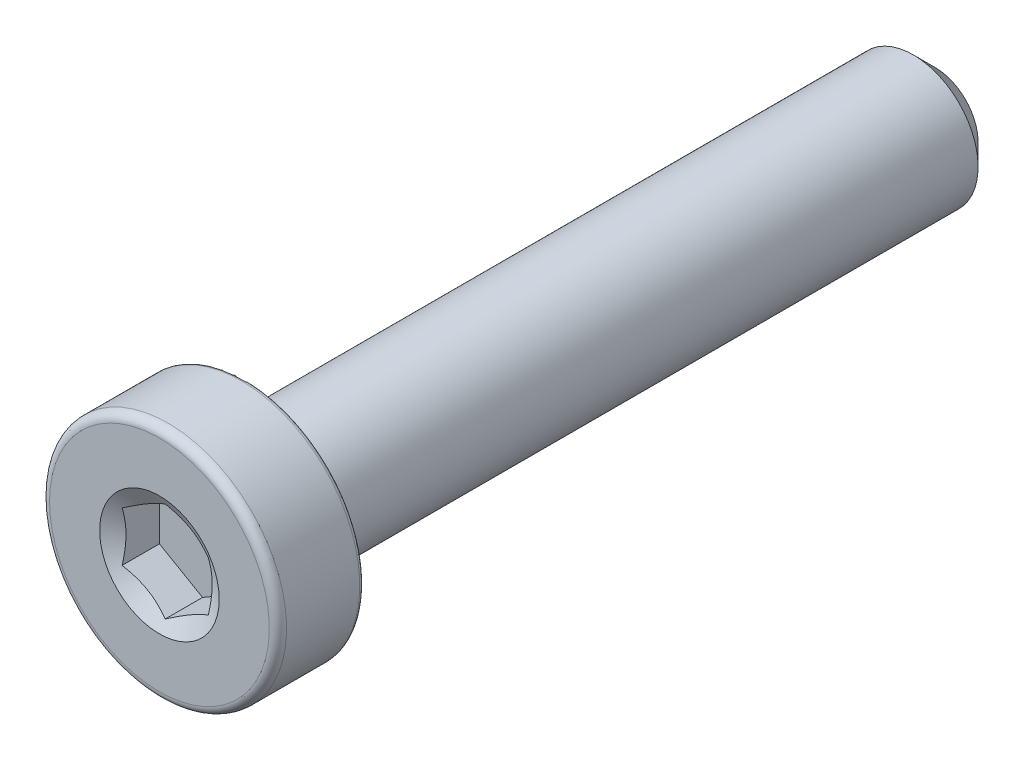
ISO-10303-21;
HEADER;
FILE_DESCRIPTION(('STEP AP214'),'2;1');
FILE_NAME('part.step','',(''),(''),'','','');
FILE_SCHEMA(('AUTOMOTIVE_DESIGN { 1 0 10303 214 1 1 1 1 }'));
ENDSEC;
DATA;
#1=APPLICATION_CONTEXT('core data for automotive mechanical design processes');
#2=APPLICATION_PROTOCOL_DEFINITION('international standard','automotive_design',2000,#1);
#3=PRODUCT_CONTEXT('',#1,'mechanical');
#4=PRODUCT('Part','Part','',(#3));
#5=PRODUCT_RELATED_PRODUCT_CATEGORY('part','',(#4));
#6=PRODUCT_DEFINITION_FORMATION('','',#4);
#7=PRODUCT_DEFINITION_CONTEXT('part definition',#1,'design');
#8=PRODUCT_DEFINITION('design','',#6,#7);
#9=PRODUCT_DEFINITION_SHAPE('','',#8);
#10=(LENGTH_UNIT() NAMED_UNIT(*) SI_UNIT(.MILLI.,.METRE.));
#11=(NAMED_UNIT(*) PLANE_ANGLE_UNIT() SI_UNIT($,.RADIAN.));
#12=(NAMED_UNIT(*) SI_UNIT($,.STERADIAN.) SOLID_ANGLE_UNIT());
#13=UNCERTAINTY_MEASURE_WITH_UNIT(LENGTH_MEASURE(1.E-05),#10,'distance_accuracy_value','');
#14=(GEOMETRIC_REPRESENTATION_CONTEXT(3) GLOBAL_UNCERTAINTY_ASSIGNED_CONTEXT((#13)) GLOBAL_UNIT_ASSIGNED_CONTEXT((#10,
#11,#12)) REPRESENTATION_CONTEXT('',''));
#15=CARTESIAN_POINT('',(0.,0.,0.));
#16=DIRECTION('',(0.,0.,1.));
#17=DIRECTION('',(1.,0.,0.));
#18=AXIS2_PLACEMENT_3D('',#15,#16,#17);
#19=CARTESIAN_POINT('',(0.,0.,-9.));
#20=DIRECTION('',(0.,0.,-1.));
#21=DIRECTION('',(-1.,0.,0.));
#22=AXIS2_PLACEMENT_3D('',#19,#20,#21);
#23=PLANE('',#22);
#24=CARTESIAN_POINT('',(0.,0.,-9.));
#25=DIRECTION('',(0.,0.,-1.));
#26=DIRECTION('',(-1.,0.,0.));
#27=AXIS2_PLACEMENT_3D('',#24,#25,#26);
#28=CIRCLE('',#27,1.);
#29=CARTESIAN_POINT('',(-1.,0.,-9.));
#30=VERTEX_POINT('',#29);
#31=EDGE_CURVE('E48',#30,#30,#28,.T.);
#32=ORIENTED_EDGE('',*,*,#31,.T.);
#33=EDGE_LOOP('',(#32));
#34=FACE_BOUND('',#33,.T.);
#35=ADVANCED_FACE('F35',(#34),#23,.T.);
#36=CARTESIAN_POINT('',(0.,0.,-9.));
#37=DIRECTION('',(0.,0.,1.));
#38=DIRECTION('',(1.,0.,0.));
#39=AXIS2_PLACEMENT_3D('',#36,#37,#38);
#40=CONICAL_SURFACE('',#39,1.,0.785398163397448);
#41=CARTESIAN_POINT('',(0.,0.,-8.5));
#42=DIRECTION('',(0.,0.,-1.));
#43=DIRECTION('',(-1.,0.,0.));
#44=AXIS2_PLACEMENT_3D('',#41,#42,#43);
#45=CIRCLE('',#44,1.5);
#46=CARTESIAN_POINT('',(-1.5,0.,-8.5));
#47=VERTEX_POINT('',#46);
#48=EDGE_CURVE('E133',#47,#47,#45,.T.);
#49=ORIENTED_EDGE('',*,*,#48,.T.);
#50=EDGE_LOOP('',(#49));
#51=FACE_BOUND('',#50,.T.);
#52=ORIENTED_EDGE('',*,*,#31,.F.);
#53=EDGE_LOOP('',(#52));
#54=FACE_BOUND('',#53,.T.);
#55=ADVANCED_FACE('F139',(#51,#54),#40,.T.);
#56=CARTESIAN_POINT('',(0.,0.,-9.));
#57=DIRECTION('',(0.,0.,-1.));
#58=DIRECTION('',(-1.,0.,0.));
#59=AXIS2_PLACEMENT_3D('',#56,#57,#58);
#60=CYLINDRICAL_SURFACE('',#59,1.5);
#61=CARTESIAN_POINT('',(0.,0.,7.));
#62=DIRECTION('',(0.,0.,-1.));
#63=DIRECTION('',(-1.,0.,0.));
#64=AXIS2_PLACEMENT_3D('',#61,#62,#63);
#65=CIRCLE('',#64,1.5);
#66=CARTESIAN_POINT('',(-1.5,0.,7.));
#67=VERTEX_POINT('',#66);
#68=EDGE_CURVE('E130',#67,#67,#65,.T.);
#69=ORIENTED_EDGE('',*,*,#68,.T.);
#70=EDGE_LOOP('',(#69));
#71=FACE_BOUND('',#70,.T.);
#72=ORIENTED_EDGE('',*,*,#48,.F.);
#73=EDGE_LOOP('',(#72));
#74=FACE_BOUND('',#73,.T.);
#75=ADVANCED_FACE('F141',(#71,#74),#60,.T.);
#76=CARTESIAN_POINT('',(0.,1.5,7.));
#77=DIRECTION('',(0.,0.,-1.));
#78=DIRECTION('',(-1.,0.,0.));
#79=AXIS2_PLACEMENT_3D('',#76,#77,#78);
#80=PLANE('',#79);
#81=CARTESIAN_POINT('',(0.,0.,7.));
#82=DIRECTION('',(0.,0.,-1.));
#83=DIRECTION('',(-1.,0.,0.));
#84=AXIS2_PLACEMENT_3D('',#81,#82,#83);
#85=CIRCLE('',#84,2.65);
#86=CARTESIAN_POINT('',(-2.65,0.,7.));
#87=VERTEX_POINT('',#86);
#88=EDGE_CURVE('E127',#87,#87,#85,.T.);
#89=ORIENTED_EDGE('',*,*,#88,.T.);
#90=EDGE_LOOP('',(#89));
#91=FACE_BOUND('',#90,.T.);
#92=ORIENTED_EDGE('',*,*,#68,.F.);
#93=EDGE_LOOP('',(#92));
#94=FACE_BOUND('',#93,.T.);
#95=ADVANCED_FACE('F147',(#91,#94),#80,.T.);
#96=CARTESIAN_POINT('',(0.,0.,7.1));
#97=DIRECTION('',(0.,0.,-1.));
#98=DIRECTION('',(-1.,0.,0.));
#99=AXIS2_PLACEMENT_3D('',#96,#97,#98);
#100=TOROIDAL_SURFACE('',#99,2.65,0.1);
#101=CARTESIAN_POINT('',(0.,0.,7.1));
#102=DIRECTION('',(0.,0.,-1.));
#103=DIRECTION('',(-1.,0.,0.));
#104=AXIS2_PLACEMENT_3D('',#101,#102,#103);
#105=CIRCLE('',#104,2.75);
#106=CARTESIAN_POINT('',(-2.75,0.,7.1));
#107=VERTEX_POINT('',#106);
#108=EDGE_CURVE('E124',#107,#107,#105,.T.);
#109=ORIENTED_EDGE('',*,*,#108,.T.);
#110=EDGE_LOOP('',(#109));
#111=FACE_BOUND('',#110,.T.);
#112=ORIENTED_EDGE('',*,*,#88,.F.);
#113=EDGE_LOOP('',(#112));
#114=FACE_BOUND('',#113,.T.);
#115=ADVANCED_FACE('F153',(#111,#114),#100,.T.);
#116=CARTESIAN_POINT('',(0.,0.,-9.));
#117=DIRECTION('',(0.,0.,-1.));
#118=DIRECTION('',(-1.,0.,0.));
#119=AXIS2_PLACEMENT_3D('',#116,#117,#118);
#120=CYLINDRICAL_SURFACE('',#119,2.75);
#121=CARTESIAN_POINT('',(0.,0.,8.8));
#122=DIRECTION('',(0.,0.,-1.));
#123=DIRECTION('',(-1.,0.,0.));
#124=AXIS2_PLACEMENT_3D('',#121,#122,#123);
#125=CIRCLE('',#124,2.75);
#126=CARTESIAN_POINT('',(-2.75,0.,8.8));
#127=VERTEX_POINT('',#126);
#128=EDGE_CURVE('E121',#127,#127,#125,.T.);
#129=ORIENTED_EDGE('',*,*,#128,.T.);
#130=EDGE_LOOP('',(#129));
#131=FACE_BOUND('',#130,.T.);
#132=ORIENTED_EDGE('',*,*,#108,.F.);
#133=EDGE_LOOP('',(#132));
#134=FACE_BOUND('',#133,.T.);
#135=ADVANCED_FACE('F157',(#131,#134),#120,.T.);
#136=CARTESIAN_POINT('',(0.,0.,8.8));
#137=DIRECTION('',(0.,0.,-1.));
#138=DIRECTION('',(-1.,0.,0.));
#139=AXIS2_PLACEMENT_3D('',#136,#137,#138);
#140=TOROIDAL_SURFACE('',#139,2.55,0.2);
#141=CARTESIAN_POINT('',(0.,0.,9.));
#142=DIRECTION('',(0.,0.,-1.));
#143=DIRECTION('',(-1.,0.,0.));
#144=AXIS2_PLACEMENT_3D('',#141,#142,#143);
#145=CIRCLE('',#144,2.55);
#146=CARTESIAN_POINT('',(-2.55,0.,9.));
#147=VERTEX_POINT('',#146);
#148=EDGE_CURVE('E118',#147,#147,#145,.T.);
#149=ORIENTED_EDGE('',*,*,#148,.T.);
#150=EDGE_LOOP('',(#149));
#151=FACE_BOUND('',#150,.T.);
#152=ORIENTED_EDGE('',*,*,#128,.F.);
#153=EDGE_LOOP('',(#152));
#154=FACE_BOUND('',#153,.T.);
#155=ADVANCED_FACE('F161',(#151,#154),#140,.T.);
#156=CARTESIAN_POINT('',(0.,2.55,9.));
#157=DIRECTION('',(0.,0.,1.));
#158=DIRECTION('',(1.,0.,0.));
#159=AXIS2_PLACEMENT_3D('',#156,#157,#158);
#160=PLANE('',#159);
#161=CARTESIAN_POINT('',(0.,0.,9.));
#162=DIRECTION('',(0.,0.,1.));
#163=DIRECTION('',(1.,0.,0.));
#164=AXIS2_PLACEMENT_3D('',#161,#162,#163);
#165=CIRCLE('',#164,1.38725044864937);
#166=CARTESIAN_POINT('',(1.38725044864937,0.,9.));
#167=VERTEX_POINT('',#166);
#168=EDGE_CURVE('E255',#167,#167,#165,.T.);
#169=ORIENTED_EDGE('',*,*,#168,.F.);
#170=EDGE_LOOP('',(#169));
#171=FACE_BOUND('',#170,.T.);
#172=ORIENTED_EDGE('',*,*,#148,.F.);
#173=EDGE_LOOP('',(#172));
#174=FACE_BOUND('',#173,.T.);
#175=ADVANCED_FACE('F165',(#171,#174),#160,.T.);
#176=CARTESIAN_POINT('',(0.,0.,9.));
#177=DIRECTION('',(0.,0.,1.));
#178=DIRECTION('',(1.,0.,0.));
#179=AXIS2_PLACEMENT_3D('',#176,#177,#178);
#180=CONICAL_SURFACE('',#179,1.38725044864937,1.0471975511966);
#181=ORIENTED_EDGE('',*,*,#168,.T.);
#182=EDGE_LOOP('',(#181));
#183=FACE_BOUND('',#182,.T.);
#184=CARTESIAN_POINT('',(1.0002,0.577234799135784,8.86580392337119));
#185=CARTESIAN_POINT('',(0.956252680601717,0.602607795820544,8.85114622035467));
#186=CARTESIAN_POINT('',(0.911926016050177,0.628199807531654,8.83781497032642));
#187=CARTESIAN_POINT('',(0.822504925328876,0.679827098330827,8.81454375432898));
#188=CARTESIAN_POINT('',(0.777408908798267,0.705863295614154,8.8046120232553));
#189=CARTESIAN_POINT('',(0.68777582947738,0.757612978088363,8.7891499415876));
#190=CARTESIAN_POINT('',(0.643252567766779,0.783318495222178,8.78351671480448));
#191=CARTESIAN_POINT('',(0.553996260284981,0.834850648373666,8.77678853534577));
#192=CARTESIAN_POINT('',(0.509263539518504,0.860677096749776,8.77568801462719));
#193=CARTESIAN_POINT('',(0.425658889182652,0.908946264126685,8.77796229900366));
#194=CARTESIAN_POINT('',(0.386774523211232,0.931396163287552,8.78077868556893));
#195=CARTESIAN_POINT('',(0.309259155014812,0.976149681982088,8.78970969692287));
#196=CARTESIAN_POINT('',(0.270628421438359,0.998453146411446,8.79582738045982));
#197=CARTESIAN_POINT('',(0.192952883515852,1.04329913914045,8.81112297243135));
#198=CARTESIAN_POINT('',(0.15391792372883,1.0658359836813,8.82036579887448));
#199=CARTESIAN_POINT('',(0.076430618723985,1.11057330008462,8.84134409246105));
#200=CARTESIAN_POINT('',(0.0379772787061378,1.13277434629517,8.85307462183919));
#201=CARTESIAN_POINT('',(-0.000200000000002924,1.15481600843309,8.86580392337119));
#202=B_SPLINE_CURVE_WITH_KNOTS('',3,(#184,#185,#186,#187,#188,#189,#190,#191,#192,#193,#194,
#195,#196,#197,#198,#199,#200,#201),.UNSPECIFIED.,.F.,.F.,(4,2,2,2,2,2,2,2,4),(0.,
0.158523820030115,0.317428970089341,0.472400167924632,0.627180939971646,0.762016584872709,
0.896977373984232,1.03493410168667,1.17261952416172),.UNSPECIFIED.);
#203=CARTESIAN_POINT('',(0.999999999999997,0.577350269189622,8.86573724670552));
#204=VERTEX_POINT('',#203);
#205=CARTESIAN_POINT('',(0.,1.15470053837925,8.86573724670552));
#206=VERTEX_POINT('',#205);
#207=EDGE_CURVE('E102',#204,#206,#202,.T.);
#208=ORIENTED_EDGE('',*,*,#207,.F.);
#209=CARTESIAN_POINT('',(0.999999999999996,-1.52531406916342,9.25209527262491));
#210=CARTESIAN_POINT('',(0.999999999999996,-1.48182861268046,9.23110266541125));
#211=CARTESIAN_POINT('',(0.999999999999996,-1.43824104401544,9.2103225414218));
#212=CARTESIAN_POINT('',(0.999999999999996,-1.35080588283853,9.16929809609279));
#213=CARTESIAN_POINT('',(0.999999999999996,-1.30695824811621,9.14905386481636));
#214=CARTESIAN_POINT('',(0.999999999999996,-1.17446402318513,9.08907572495865));
#215=CARTESIAN_POINT('',(0.999999999999996,-1.08535857783385,9.05033728704522));
#216=CARTESIAN_POINT('',(0.999999999999996,-0.902813286780576,8.97597487261951));
#217=CARTESIAN_POINT('',(0.999999999999997,-0.809322697025034,8.94047389642041));
#218=CARTESIAN_POINT('',(0.999999999999997,-0.619948426356521,8.87691775005073));
#219=CARTESIAN_POINT('',(0.999999999999996,-0.524071266658433,8.84884430376285));
#220=CARTESIAN_POINT('',(0.999999999999997,-0.378406603927923,8.81584291166321));
#221=CARTESIAN_POINT('',(0.999999999999997,-0.329661184931859,8.80637232219308));
#222=CARTESIAN_POINT('',(0.999999999999997,-0.231590729483153,8.79107470800451));
#223=CARTESIAN_POINT('',(0.999999999999997,-0.182265743798226,8.78524736654073));
#224=CARTESIAN_POINT('',(0.999999999999997,-0.0839161152817316,8.7777760886091));
#225=CARTESIAN_POINT('',(0.999999999999997,-0.0348955138861114,8.77608038814163));
#226=CARTESIAN_POINT('',(0.999999999999997,0.0631106437129204,8.77687621074871));
#227=CARTESIAN_POINT('',(0.999999999999997,0.112096198103291,8.77936793670139));
#228=CARTESIAN_POINT('',(0.999999999999997,0.231132047870783,8.7902915878432));
#229=CARTESIAN_POINT('',(0.999999999999997,0.300987455206452,8.80085135420135));
#230=CARTESIAN_POINT('',(0.999999999999997,0.439393345717322,8.82857147462579));
#231=CARTESIAN_POINT('',(0.999999999999997,0.507942223075051,8.84573946268281));
#232=CARTESIAN_POINT('',(0.999999999999997,0.610490153022872,8.87528485985339));
#233=CARTESIAN_POINT('',(0.999999999999997,0.645014670741595,8.88590779291819));
#234=CARTESIAN_POINT('',(0.999999999999997,0.713703860484178,8.90819373506489));
#235=CARTESIAN_POINT('',(0.999999999999997,0.747868738383105,8.91985610834604));
#236=CARTESIAN_POINT('',(0.999999999999997,0.849894218405036,8.95613455789374));
#237=CARTESIAN_POINT('',(0.999999999999997,0.917293751200417,8.98204438461689));
#238=CARTESIAN_POINT('',(0.999999999999997,1.03934046620428,9.03147531764067));
#239=CARTESIAN_POINT('',(0.999999999999997,1.09414518158637,9.05461480046635));
#240=CARTESIAN_POINT('',(0.999999999999997,1.20322444414755,9.10211549084186));
#241=CARTESIAN_POINT('',(0.999999999999997,1.25749896725618,9.12647675355475));
#242=CARTESIAN_POINT('',(0.999999999999997,1.41971593401094,9.20094472569166));
#243=CARTESIAN_POINT('',(0.999999999999997,1.52702559075604,9.25242465614905));
#244=CARTESIAN_POINT('',(0.999999999999997,1.74069917257064,9.35765571572189));
#245=CARTESIAN_POINT('',(0.999999999999997,1.84706155682499,9.4114099346413));
#246=CARTESIAN_POINT('',(0.999999999999997,2.05903153278512,9.52034282574241));
#247=CARTESIAN_POINT('',(0.999999999999998,2.16463924030401,9.57552127309501));
#248=CARTESIAN_POINT('',(0.999999999999998,2.36471708801433,9.68123542491892));
#249=CARTESIAN_POINT('',(0.999999999999998,2.45923648811061,9.7316782365578));
#250=CARTESIAN_POINT('',(0.999999999999998,2.64797010813398,9.83314147876285));
#251=CARTESIAN_POINT('',(0.999999999999998,2.74218431378497,9.88416193586177));
#252=CARTESIAN_POINT('',(0.999999999999998,2.93010687272875,9.98648491478121));
#253=CARTESIAN_POINT('',(0.999999999999998,3.02381590124115,10.0377861982146));
#254=CARTESIAN_POINT('',(0.999999999999998,3.21104433026394,10.140720116336));
#255=CARTESIAN_POINT('',(0.999999999999998,3.3045637421293,10.1923527303624));
#256=CARTESIAN_POINT('',(0.999999999999998,3.39801583309777,10.244106162613));
#257=B_SPLINE_CURVE_WITH_KNOTS('',3,(#209,#210,#211,#212,#213,#214,#215,#216,#217,#218,#219,
#220,#221,#222,#223,#224,#225,#226,#227,#228,#229,#230,#231,#232,#233,#234,#235,#236,#237,#238,
#239,#240,#241,#242,#243,#244,#245,#246,#247,#248,#249,#250,#251,#252,#253,#254,#255,#256),
.UNSPECIFIED.,.F.,.F.,(4,2,2,2,2,2,2,2,2,2,2,2,2,2,2,2,2,2,2,2,2,2,2,4),(0.,0.144860035350267,
0.28974426354594,0.581156970731407,0.88102618477544,1.18015053255112,1.32900921447324,
1.47785495276638,1.62482603693997,1.77180424197377,1.98331769369783,2.19507622821808,
2.30342893158603,2.41171580717751,2.62826427599132,2.80671773664952,2.98517926170136,
3.34218741743347,3.69969723551897,4.05715095805976,4.37856050020064,4.69998486589634,
5.02048193585065,5.34095921015368),.UNSPECIFIED.);
#258=CARTESIAN_POINT('',(0.999999999999997,-0.577350269189624,8.86573724670552));
#259=VERTEX_POINT('',#258);
#260=EDGE_CURVE('E211',#259,#204,#257,.T.);
#261=ORIENTED_EDGE('',*,*,#260,.F.);
#262=CARTESIAN_POINT('',(-0.000200000000000269,-1.15481600843309,8.86580392337119));
#263=CARTESIAN_POINT('',(0.0437473193982793,-1.12944301174833,8.85114622035467));
#264=CARTESIAN_POINT('',(0.0880739839498194,-1.10385100003722,8.83781497032642));
#265=CARTESIAN_POINT('',(0.177495074671121,-1.05222370923804,8.81454375432898));
#266=CARTESIAN_POINT('',(0.22259109120173,-1.02618751195472,8.80461202325531));
#267=CARTESIAN_POINT('',(0.312224170522618,-0.974437829480508,8.7891499415876));
#268=CARTESIAN_POINT('',(0.356747432233218,-0.948732312346692,8.78351671480448));
#269=CARTESIAN_POINT('',(0.446003739715016,-0.897200159195205,8.77678853534578));
#270=CARTESIAN_POINT('',(0.490736460481493,-0.871373710819095,8.77568801462719));
#271=CARTESIAN_POINT('',(0.574341110817345,-0.823104543442186,8.77796229900366));
#272=CARTESIAN_POINT('',(0.613225476788764,-0.800654644281319,8.78077868556893));
#273=CARTESIAN_POINT('',(0.690740844985184,-0.755901125586783,8.78970969692287));
#274=CARTESIAN_POINT('',(0.729371578561637,-0.733597661157425,8.79582738045982));
#275=CARTESIAN_POINT('',(0.807047116484142,-0.688751668428418,8.81112297243135));
#276=CARTESIAN_POINT('',(0.846082076271165,-0.666214823887574,8.82036579887448));
#277=CARTESIAN_POINT('',(0.923569381276009,-0.621477507484248,8.84134409246105));
#278=CARTESIAN_POINT('',(0.962022721293856,-0.599276461273704,8.85307462183919));
#279=CARTESIAN_POINT('',(1.0002,-0.577234799135787,8.86580392337119));
#280=B_SPLINE_CURVE_WITH_KNOTS('',3,(#262,#263,#264,#265,#266,#267,#268,#269,#270,#271,#272,
#273,#274,#275,#276,#277,#278,#279),.UNSPECIFIED.,.F.,.F.,(4,2,2,2,2,2,2,2,4),(0.,
0.158523820030115,0.317428970089341,0.472400167924632,0.627180939971646,0.762016584872709,
0.89697737398423,1.03493410168667,1.17261952416172),.UNSPECIFIED.);
#281=CARTESIAN_POINT('',(0.,-1.15470053837925,8.86573724670552));
#282=VERTEX_POINT('',#281);
#283=EDGE_CURVE('E205',#282,#259,#280,.T.);
#284=ORIENTED_EDGE('',*,*,#283,.F.);
#285=CARTESIAN_POINT('',(-1.0002,-0.577234799135788,8.86580392337119));
#286=CARTESIAN_POINT('',(-0.956252680601717,-0.602607795820547,8.85114622035467));
#287=CARTESIAN_POINT('',(-0.911926016050177,-0.628199807531657,8.83781497032642));
#288=CARTESIAN_POINT('',(-0.822504925328876,-0.679827098330831,8.81454375432898));
#289=CARTESIAN_POINT('',(-0.777408908798266,-0.705863295614158,8.80461202325531));
#290=CARTESIAN_POINT('',(-0.687775829477379,-0.757612978088367,8.7891499415876));
#291=CARTESIAN_POINT('',(-0.643252567766779,-0.783318495222182,8.78351671480448));
#292=CARTESIAN_POINT('',(-0.553996260284981,-0.83485064837367,8.77678853534578));
#293=CARTESIAN_POINT('',(-0.509263539518504,-0.86067709674978,8.77568801462719));
#294=CARTESIAN_POINT('',(-0.425658889182652,-0.908946264126688,8.77796229900366));
#295=CARTESIAN_POINT('',(-0.386774523211233,-0.931396163287555,8.78077868556893));
#296=CARTESIAN_POINT('',(-0.309259155014813,-0.976149681982091,8.78970969692287));
#297=CARTESIAN_POINT('',(-0.27062842143836,-0.998453146411449,8.79582738045982));
#298=CARTESIAN_POINT('',(-0.192952883515855,-1.04329913914046,8.81112297243135));
#299=CARTESIAN_POINT('',(-0.153917923728832,-1.0658359836813,8.82036579887448));
#300=CARTESIAN_POINT('',(-0.0764306187239882,-1.11057330008463,8.84134409246105));
#301=CARTESIAN_POINT('',(-0.0379772787061411,-1.13277434629517,8.85307462183919));
#302=CARTESIAN_POINT('',(0.000199999999999541,-1.15481600843309,8.86580392337119));
#303=B_SPLINE_CURVE_WITH_KNOTS('',3,(#285,#286,#287,#288,#289,#290,#291,#292,#293,#294,#295,
#296,#297,#298,#299,#300,#301,#302),.UNSPECIFIED.,.F.,.F.,(4,2,2,2,2,2,2,2,4),(0.,
0.158523820030115,0.317428970089341,0.472400167924631,0.627180939971646,0.762016584872708,
0.896977373984229,1.03493410168667,1.17261952416171),.UNSPECIFIED.);
#304=CARTESIAN_POINT('',(-0.999999999999997,-0.577350269189626,8.86573724670552));
#305=VERTEX_POINT('',#304);
#306=EDGE_CURVE('E55',#305,#282,#303,.T.);
#307=ORIENTED_EDGE('',*,*,#306,.F.);
#308=CARTESIAN_POINT('',(-0.999999999999996,-1.52531406916343,9.25209527262491));
#309=CARTESIAN_POINT('',(-0.999999999999997,-1.48182861268046,9.23110266541126));
#310=CARTESIAN_POINT('',(-0.999999999999997,-1.43824104401544,9.21032254142181));
#311=CARTESIAN_POINT('',(-0.999999999999997,-1.35080588283854,9.16929809609279));
#312=CARTESIAN_POINT('',(-0.999999999999997,-1.30695824811622,9.14905386481637));
#313=CARTESIAN_POINT('',(-0.999999999999997,-1.17446402318513,9.08907572495865));
#314=CARTESIAN_POINT('',(-0.999999999999997,-1.08535857783386,9.05033728704522));
#315=CARTESIAN_POINT('',(-0.999999999999997,-0.902813286780579,8.97597487261951));
#316=CARTESIAN_POINT('',(-0.999999999999997,-0.809322697025038,8.94047389642042));
#317=CARTESIAN_POINT('',(-0.999999999999997,-0.619948426356524,8.87691775005074));
#318=CARTESIAN_POINT('',(-0.999999999999997,-0.524071266658436,8.84884430376285));
#319=CARTESIAN_POINT('',(-0.999999999999998,-0.378406603927925,8.81584291166321));
#320=CARTESIAN_POINT('',(-0.999999999999998,-0.329661184931861,8.80637232219308));
#321=CARTESIAN_POINT('',(-0.999999999999998,-0.231590729483154,8.79107470800451));
#322=CARTESIAN_POINT('',(-0.999999999999998,-0.182265743798227,8.78524736654074));
#323=CARTESIAN_POINT('',(-0.999999999999998,-0.0839161152817324,8.7777760886091));
#324=CARTESIAN_POINT('',(-0.999999999999998,-0.0348955138861119,8.77608038814163));
#325=CARTESIAN_POINT('',(-0.999999999999998,0.0631106437129202,8.77687621074871));
#326=CARTESIAN_POINT('',(-0.999999999999998,0.112096198103291,8.77936793670139));
#327=CARTESIAN_POINT('',(-0.999999999999998,0.231132047870784,8.7902915878432));
#328=CARTESIAN_POINT('',(-0.999999999999999,0.300987455206452,8.80085135420135));
#329=CARTESIAN_POINT('',(-0.999999999999999,0.439393345717323,8.82857147462579));
#330=CARTESIAN_POINT('',(-0.999999999999999,0.507942223075052,8.84573946268281));
#331=CARTESIAN_POINT('',(-0.999999999999999,0.610490153022873,8.87528485985339));
#332=CARTESIAN_POINT('',(-0.999999999999999,0.645014670741595,8.88590779291819));
#333=CARTESIAN_POINT('',(-0.999999999999999,0.713703860484179,8.90819373506489));
#334=CARTESIAN_POINT('',(-0.999999999999999,0.747868738383106,8.91985610834604));
#335=CARTESIAN_POINT('',(-0.999999999999999,0.849894218405037,8.95613455789374));
#336=CARTESIAN_POINT('',(-0.999999999999999,0.917293751200418,8.98204438461689));
#337=CARTESIAN_POINT('',(-0.999999999999999,1.03934046620429,9.03147531764068));
#338=CARTESIAN_POINT('',(-0.999999999999999,1.09414518158637,9.05461480046635));
#339=CARTESIAN_POINT('',(-0.999999999999999,1.20322444414755,9.10211549084187));
#340=CARTESIAN_POINT('',(-1.,1.25749896725618,9.12647675355475));
#341=CARTESIAN_POINT('',(-1.,1.41971593401095,9.20094472569166));
#342=CARTESIAN_POINT('',(-1.,1.52702559075604,9.25242465614905));
#343=CARTESIAN_POINT('',(-1.,1.74069917257065,9.3576557157219));
#344=CARTESIAN_POINT('',(-1.,1.847061556825,9.41140993464131));
#345=CARTESIAN_POINT('',(-1.,2.05903153278512,9.52034282574242));
#346=CARTESIAN_POINT('',(-1.,2.16463924030401,9.57552127309501));
#347=CARTESIAN_POINT('',(-1.,2.36471708801434,9.68123542491893));
#348=CARTESIAN_POINT('',(-1.,2.45923648811061,9.7316782365578));
#349=CARTESIAN_POINT('',(-1.,2.64797010813399,9.83314147876285));
#350=CARTESIAN_POINT('',(-1.,2.74218431378498,9.88416193586178));
#351=CARTESIAN_POINT('',(-1.,2.93010687272876,9.98648491478122));
#352=CARTESIAN_POINT('',(-1.,3.02381590124115,10.0377861982146));
#353=CARTESIAN_POINT('',(-1.,3.21104433026394,10.140720116336));
#354=CARTESIAN_POINT('',(-1.,3.3045637421293,10.1923527303624));
#355=CARTESIAN_POINT('',(-1.,3.39801583309777,10.244106162613));
#356=B_SPLINE_CURVE_WITH_KNOTS('',3,(#308,#309,#310,#311,#312,#313,#314,#315,#316,#317,#318,
#319,#320,#321,#322,#323,#324,#325,#326,#327,#328,#329,#330,#331,#332,#333,#334,#335,#336,#337,
#338,#339,#340,#341,#342,#343,#344,#345,#346,#347,#348,#349,#350,#351,#352,#353,#354,#355),
.UNSPECIFIED.,.F.,.F.,(4,2,2,2,2,2,2,2,2,2,2,2,2,2,2,2,2,2,2,2,2,2,2,4),(0.,0.144860035350268,
0.28974426354594,0.581156970731408,0.881026184775441,1.18015053255113,1.32900921447324,
1.47785495276638,1.62482603693997,1.77180424197378,1.98331769369784,2.19507622821809,
2.30342893158604,2.41171580717752,2.62826427599132,2.80671773664952,2.98517926170136,
3.34218741743348,3.69969723551898,4.05715095805977,4.37856050020066,4.69998486589635,
5.02048193585066,5.34095921015369),.UNSPECIFIED.);
#357=CARTESIAN_POINT('',(-0.999999999999999,0.577350269189624,8.86573724670552));
#358=VERTEX_POINT('',#357);
#359=EDGE_CURVE('E11',#358,#305,#356,.F.);
#360=ORIENTED_EDGE('',*,*,#359,.F.);
#361=CARTESIAN_POINT('',(0.00019999999999696,1.15481600843309,8.86580392337119));
#362=CARTESIAN_POINT('',(-0.0437473193982829,1.12944301174833,8.85114622035467));
#363=CARTESIAN_POINT('',(-0.0880739839498231,1.10385100003722,8.83781497032642));
#364=CARTESIAN_POINT('',(-0.177495074671124,1.05222370923804,8.81454375432898));
#365=CARTESIAN_POINT('',(-0.222591091201733,1.02618751195472,8.80461202325531));
#366=CARTESIAN_POINT('',(-0.31222417052262,0.974437829480507,8.7891499415876));
#367=CARTESIAN_POINT('',(-0.356747432233221,0.948732312346691,8.78351671480448));
#368=CARTESIAN_POINT('',(-0.446003739715019,0.897200159195204,8.77678853534578));
#369=CARTESIAN_POINT('',(-0.490736460481496,0.871373710819094,8.77568801462719));
#370=CARTESIAN_POINT('',(-0.574341110817348,0.823104543442185,8.77796229900366));
#371=CARTESIAN_POINT('',(-0.613225476788767,0.800654644281318,8.78077868556893));
#372=CARTESIAN_POINT('',(-0.690740844985187,0.755901125586782,8.78970969692287));
#373=CARTESIAN_POINT('',(-0.729371578561639,0.733597661157425,8.79582738045982));
#374=CARTESIAN_POINT('',(-0.807047116484145,0.688751668428417,8.81112297243135));
#375=CARTESIAN_POINT('',(-0.846082076271167,0.666214823887573,8.82036579887448));
#376=CARTESIAN_POINT('',(-0.923569381276011,0.621477507484248,8.84134409246105));
#377=CARTESIAN_POINT('',(-0.962022721293858,0.599276461273704,8.85307462183919));
#378=CARTESIAN_POINT('',(-1.0002,0.577234799135786,8.86580392337119));
#379=B_SPLINE_CURVE_WITH_KNOTS('',3,(#361,#362,#363,#364,#365,#366,#367,#368,#369,#370,#371,
#372,#373,#374,#375,#376,#377,#378),.UNSPECIFIED.,.F.,.F.,(4,2,2,2,2,2,2,2,4),(0.,
0.158523820030115,0.317428970089341,0.472400167924632,0.627180939971646,0.762016584872708,
0.896977373984229,1.03493410168667,1.17261952416171),.UNSPECIFIED.);
#380=EDGE_CURVE('E93',#206,#358,#379,.T.);
#381=ORIENTED_EDGE('',*,*,#380,.F.);
#382=EDGE_LOOP('',(#208,#261,#284,#307,#360,#381));
#383=FACE_BOUND('',#382,.T.);
#384=ADVANCED_FACE('F92',(#183,#383),#180,.F.);
#385=CARTESIAN_POINT('',(0.,0.,8.));
#386=DIRECTION('',(0.,0.,1.));
#387=DIRECTION('',(1.,0.,0.));
#388=AXIS2_PLACEMENT_3D('',#385,#386,#387);
#389=PLANE('',#388);
#390=DIRECTION('',(-0.866025403784439,-0.5,0.));
#391=VECTOR('',#390,1.);
#392=CARTESIAN_POINT('',(0.,1.15470053837925,8.));
#393=LINE('',#392,#391);
#394=CARTESIAN_POINT('',(0.,1.15470053837925,8.));
#395=VERTEX_POINT('',#394);
#396=CARTESIAN_POINT('',(-0.999999999999999,0.577350269189624,8.));
#397=VERTEX_POINT('',#396);
#398=EDGE_CURVE('E101',#395,#397,#393,.T.);
#399=ORIENTED_EDGE('',*,*,#398,.T.);
#400=DIRECTION('',(0.,-1.,0.));
#401=VECTOR('',#400,1.);
#402=CARTESIAN_POINT('',(-0.999999999999999,0.577350269189624,8.));
#403=LINE('',#402,#401);
#404=CARTESIAN_POINT('',(-0.999999999999997,-0.577350269189626,8.));
#405=VERTEX_POINT('',#404);
#406=EDGE_CURVE('E106',#397,#405,#403,.T.);
#407=ORIENTED_EDGE('',*,*,#406,.T.);
#408=DIRECTION('',(0.866025403784439,-0.499999999999999,0.));
#409=VECTOR('',#408,1.);
#410=CARTESIAN_POINT('',(-0.999999999999997,-0.577350269189626,8.));
#411=LINE('',#410,#409);
#412=CARTESIAN_POINT('',(0.,-1.15470053837925,8.));
#413=VERTEX_POINT('',#412);
#414=EDGE_CURVE('E237',#405,#413,#411,.T.);
#415=ORIENTED_EDGE('',*,*,#414,.T.);
#416=DIRECTION('',(0.866025403784438,0.5,0.));
#417=VECTOR('',#416,1.);
#418=CARTESIAN_POINT('',(0.,-1.15470053837925,8.));
#419=LINE('',#418,#417);
#420=CARTESIAN_POINT('',(0.999999999999997,-0.577350269189625,8.));
#421=VERTEX_POINT('',#420);
#422=EDGE_CURVE('E241',#413,#421,#419,.T.);
#423=ORIENTED_EDGE('',*,*,#422,.T.);
#424=DIRECTION('',(0.,1.,0.));
#425=VECTOR('',#424,1.);
#426=CARTESIAN_POINT('',(0.999999999999997,-0.577350269189625,8.));
#427=LINE('',#426,#425);
#428=CARTESIAN_POINT('',(0.999999999999997,0.577350269189622,8.));
#429=VERTEX_POINT('',#428);
#430=EDGE_CURVE('E114',#421,#429,#427,.T.);
#431=ORIENTED_EDGE('',*,*,#430,.T.);
#432=DIRECTION('',(-0.866025403784439,0.5,0.));
#433=VECTOR('',#432,1.);
#434=CARTESIAN_POINT('',(0.999999999999997,0.577350269189622,8.));
#435=LINE('',#434,#433);
#436=EDGE_CURVE('E109',#429,#395,#435,.T.);
#437=ORIENTED_EDGE('',*,*,#436,.T.);
#438=EDGE_LOOP('',(#399,#407,#415,#423,#431,#437));
#439=FACE_BOUND('',#438,.T.);
#440=ADVANCED_FACE('F191',(#439),#389,.T.);
#441=CARTESIAN_POINT('',(-0.999999999999999,0.577350269189624,8.));
#442=DIRECTION('',(-1.,0.,0.));
#443=DIRECTION('',(0.,-1.,0.));
#444=AXIS2_PLACEMENT_3D('',#441,#442,#443);
#445=PLANE('',#444);
#446=DIRECTION('',(0.,0.,1.));
#447=VECTOR('',#446,1.);
#448=CARTESIAN_POINT('',(-0.999999999999999,0.577350269189624,8.));
#449=LINE('',#448,#447);
#450=EDGE_CURVE('E99',#397,#358,#449,.T.);
#451=ORIENTED_EDGE('',*,*,#450,.T.);
#452=ORIENTED_EDGE('',*,*,#359,.T.);
#453=DIRECTION('',(0.,0.,1.));
#454=VECTOR('',#453,1.);
#455=CARTESIAN_POINT('',(-0.999999999999997,-0.577350269189626,8.));
#456=LINE('',#455,#454);
#457=EDGE_CURVE('E108',#405,#305,#456,.T.);
#458=ORIENTED_EDGE('',*,*,#457,.F.);
#459=ORIENTED_EDGE('',*,*,#406,.F.);
#460=EDGE_LOOP('',(#451,#452,#458,#459));
#461=FACE_BOUND('',#460,.T.);
#462=ADVANCED_FACE('F104',(#461),#445,.F.);
#463=CARTESIAN_POINT('',(-0.999999999999997,-0.577350269189626,8.));
#464=DIRECTION('',(-0.499999999999999,-0.866025403784439,0.));
#465=DIRECTION('',(0.866025403784439,-0.5,0.));
#466=AXIS2_PLACEMENT_3D('',#463,#464,#465);
#467=PLANE('',#466);
#468=ORIENTED_EDGE('',*,*,#457,.T.);
#469=ORIENTED_EDGE('',*,*,#306,.T.);
#470=DIRECTION('',(0.,0.,1.));
#471=VECTOR('',#470,1.);
#472=CARTESIAN_POINT('',(0.,-1.15470053837925,8.));
#473=LINE('',#472,#471);
#474=EDGE_CURVE('E111',#413,#282,#473,.T.);
#475=ORIENTED_EDGE('',*,*,#474,.F.);
#476=ORIENTED_EDGE('',*,*,#414,.F.);
#477=EDGE_LOOP('',(#468,#469,#475,#476));
#478=FACE_BOUND('',#477,.T.);
#479=ADVANCED_FACE('F226',(#478),#467,.F.);
#480=CARTESIAN_POINT('',(0.,-1.15470053837925,8.));
#481=DIRECTION('',(0.5,-0.866025403784439,0.));
#482=DIRECTION('',(0.866025403784439,0.5,0.));
#483=AXIS2_PLACEMENT_3D('',#480,#481,#482);
#484=PLANE('',#483);
#485=ORIENTED_EDGE('',*,*,#474,.T.);
#486=ORIENTED_EDGE('',*,*,#283,.T.);
#487=DIRECTION('',(0.,0.,1.));
#488=VECTOR('',#487,1.);
#489=CARTESIAN_POINT('',(0.999999999999997,-0.577350269189625,8.));
#490=LINE('',#489,#488);
#491=EDGE_CURVE('E251',#421,#259,#490,.T.);
#492=ORIENTED_EDGE('',*,*,#491,.F.);
#493=ORIENTED_EDGE('',*,*,#422,.F.);
#494=EDGE_LOOP('',(#485,#486,#492,#493));
#495=FACE_BOUND('',#494,.T.);
#496=ADVANCED_FACE('F221',(#495),#484,.F.);
#497=CARTESIAN_POINT('',(0.999999999999997,-0.577350269189625,8.));
#498=DIRECTION('',(1.,0.,0.));
#499=DIRECTION('',(0.,1.,0.));
#500=AXIS2_PLACEMENT_3D('',#497,#498,#499);
#501=PLANE('',#500);
#502=ORIENTED_EDGE('',*,*,#491,.T.);
#503=ORIENTED_EDGE('',*,*,#260,.T.);
#504=DIRECTION('',(0.,0.,1.));
#505=VECTOR('',#504,1.);
#506=CARTESIAN_POINT('',(0.999999999999997,0.577350269189622,8.));
#507=LINE('',#506,#505);
#508=EDGE_CURVE('E248',#429,#204,#507,.T.);
#509=ORIENTED_EDGE('',*,*,#508,.F.);
#510=ORIENTED_EDGE('',*,*,#430,.F.);
#511=EDGE_LOOP('',(#502,#503,#509,#510));
#512=FACE_BOUND('',#511,.T.);
#513=ADVANCED_FACE('F218',(#512),#501,.F.);
#514=CARTESIAN_POINT('',(0.999999999999997,0.577350269189622,8.));
#515=DIRECTION('',(0.5,0.866025403784439,0.));
#516=DIRECTION('',(-0.866025403784439,0.5,0.));
#517=AXIS2_PLACEMENT_3D('',#514,#515,#516);
#518=PLANE('',#517);
#519=ORIENTED_EDGE('',*,*,#508,.T.);
#520=ORIENTED_EDGE('',*,*,#207,.T.);
#521=DIRECTION('',(0.,0.,1.));
#522=VECTOR('',#521,1.);
#523=CARTESIAN_POINT('',(0.,1.15470053837925,8.));
#524=LINE('',#523,#522);
#525=EDGE_CURVE('E62',#395,#206,#524,.T.);
#526=ORIENTED_EDGE('',*,*,#525,.F.);
#527=ORIENTED_EDGE('',*,*,#436,.F.);
#528=EDGE_LOOP('',(#519,#520,#526,#527));
#529=FACE_BOUND('',#528,.T.);
#530=ADVANCED_FACE('F172',(#529),#518,.F.);
#531=CARTESIAN_POINT('',(0.,1.15470053837925,8.));
#532=DIRECTION('',(-0.5,0.866025403784439,0.));
#533=DIRECTION('',(-0.866025403784439,-0.5,0.));
#534=AXIS2_PLACEMENT_3D('',#531,#532,#533);
#535=PLANE('',#534);
#536=ORIENTED_EDGE('',*,*,#525,.T.);
#537=ORIENTED_EDGE('',*,*,#380,.T.);
#538=ORIENTED_EDGE('',*,*,#450,.F.);
#539=ORIENTED_EDGE('',*,*,#398,.F.);
#540=EDGE_LOOP('',(#536,#537,#538,#539));
#541=FACE_BOUND('',#540,.T.);
#542=ADVANCED_FACE('F98',(#541),#535,.F.);
#543=CLOSED_SHELL('',(#35,#55,#75,#95,#115,#135,#155,#175,#384,#440,#462,#479,#496,#513,#530,#542));
#544=MANIFOLD_SOLID_BREP('B2',#543);
#545=ADVANCED_BREP_SHAPE_REPRESENTATION('',(#18,#544),#14);
#546=SHAPE_DEFINITION_REPRESENTATION(#9,#545);
ENDSEC;
END-ISO-10303-21;
